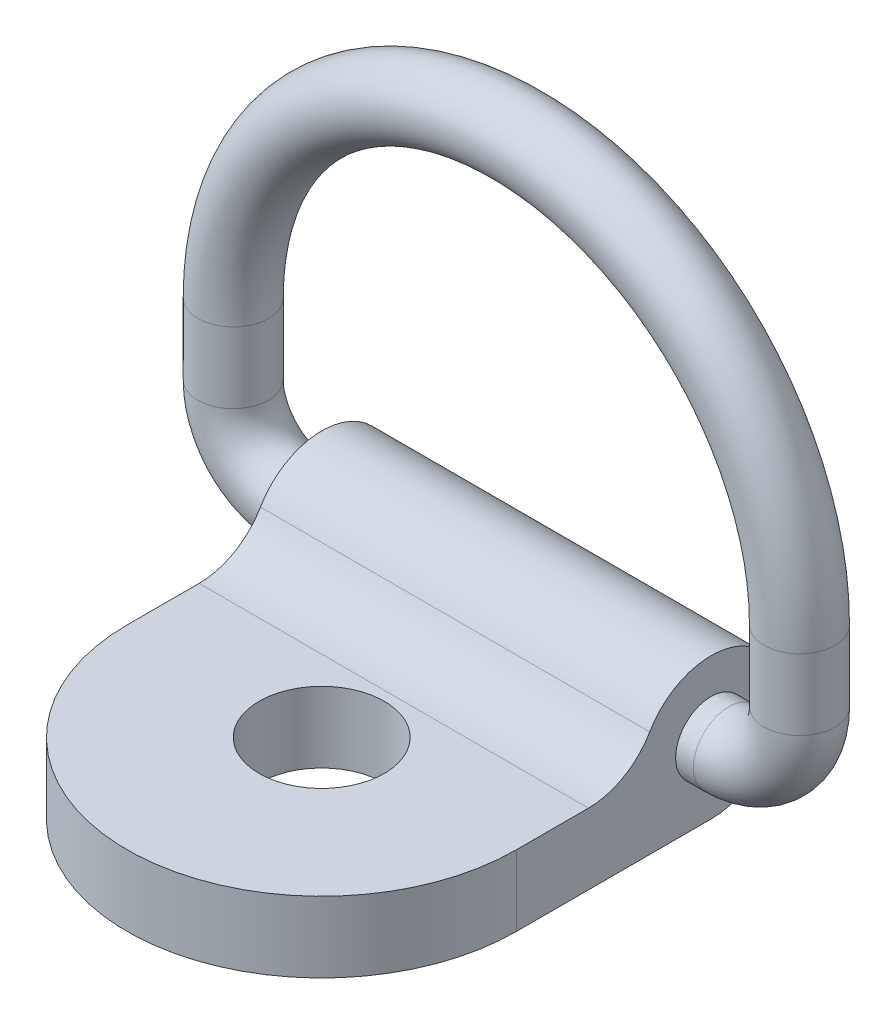
ISO-10303-21;
HEADER;
FILE_DESCRIPTION(('STEP AP214'),'2;1');
FILE_NAME('part.step','',(''),(''),'','','');
FILE_SCHEMA(('AUTOMOTIVE_DESIGN { 1 0 10303 214 1 1 1 1 }'));
ENDSEC;
DATA;
#1=APPLICATION_CONTEXT('core data for automotive mechanical design processes');
#2=APPLICATION_PROTOCOL_DEFINITION('international standard','automotive_design',2000,#1);
#3=PRODUCT_CONTEXT('',#1,'mechanical');
#4=PRODUCT('Part','Part','',(#3));
#5=PRODUCT_RELATED_PRODUCT_CATEGORY('part','',(#4));
#6=PRODUCT_DEFINITION_FORMATION('','',#4);
#7=PRODUCT_DEFINITION_CONTEXT('part definition',#1,'design');
#8=PRODUCT_DEFINITION('design','',#6,#7);
#9=PRODUCT_DEFINITION_SHAPE('','',#8);
#10=(LENGTH_UNIT() NAMED_UNIT(*) SI_UNIT(.MILLI.,.METRE.));
#11=(NAMED_UNIT(*) PLANE_ANGLE_UNIT() SI_UNIT($,.RADIAN.));
#12=(NAMED_UNIT(*) SI_UNIT($,.STERADIAN.) SOLID_ANGLE_UNIT());
#13=UNCERTAINTY_MEASURE_WITH_UNIT(LENGTH_MEASURE(1.E-05),#10,'distance_accuracy_value','');
#14=(GEOMETRIC_REPRESENTATION_CONTEXT(3) GLOBAL_UNCERTAINTY_ASSIGNED_CONTEXT((#13)) GLOBAL_UNIT_ASSIGNED_CONTEXT((#10,
#11,#12)) REPRESENTATION_CONTEXT('',''));
#15=CARTESIAN_POINT('',(0.,0.,0.));
#16=DIRECTION('',(0.,0.,1.));
#17=DIRECTION('',(1.,0.,0.));
#18=AXIS2_PLACEMENT_3D('',#15,#16,#17);
#19=CARTESIAN_POINT('',(0.,-3.175,8.73125));
#20=DIRECTION('',(0.,-1.,0.));
#21=DIRECTION('',(0.,0.,-1.));
#22=AXIS2_PLACEMENT_3D('',#19,#20,#21);
#23=CYLINDRICAL_SURFACE('',#22,8.73125);
#24=DIRECTION('',(0.,1.,0.));
#25=VECTOR('',#24,1.);
#26=CARTESIAN_POINT('',(-8.73125,-3.175,8.73125));
#27=LINE('',#26,#25);
#28=CARTESIAN_POINT('',(-8.73125,-3.175,8.73125));
#29=VERTEX_POINT('',#28);
#30=CARTESIAN_POINT('',(-8.73125,0.,8.73125));
#31=VERTEX_POINT('',#30);
#32=EDGE_CURVE('E164',#29,#31,#27,.T.);
#33=ORIENTED_EDGE('',*,*,#32,.F.);
#34=CARTESIAN_POINT('',(0.,-3.175,8.73125));
#35=DIRECTION('',(0.,1.,0.));
#36=DIRECTION('',(0.,0.,1.));
#37=AXIS2_PLACEMENT_3D('',#34,#35,#36);
#38=CIRCLE('',#37,8.73125);
#39=CARTESIAN_POINT('',(8.73125,-3.175,8.73125));
#40=VERTEX_POINT('',#39);
#41=EDGE_CURVE('E47',#40,#29,#38,.F.);
#42=ORIENTED_EDGE('',*,*,#41,.F.);
#43=DIRECTION('',(0.,-1.,0.));
#44=VECTOR('',#43,1.);
#45=CARTESIAN_POINT('',(8.73125,3.175,8.73125000000001));
#46=LINE('',#45,#44);
#47=CARTESIAN_POINT('',(8.73125,0.,8.73125));
#48=VERTEX_POINT('',#47);
#49=EDGE_CURVE('E91',#48,#40,#46,.T.);
#50=ORIENTED_EDGE('',*,*,#49,.F.);
#51=CARTESIAN_POINT('',(0.,0.,8.73125));
#52=DIRECTION('',(0.,-1.,0.));
#53=DIRECTION('',(0.,0.,-1.));
#54=AXIS2_PLACEMENT_3D('',#51,#52,#53);
#55=CIRCLE('',#54,8.73125);
#56=EDGE_CURVE('E11',#31,#48,#55,.F.);
#57=ORIENTED_EDGE('',*,*,#56,.F.);
#58=EDGE_LOOP('',(#33,#42,#50,#57));
#59=FACE_BOUND('',#58,.T.);
#60=ADVANCED_FACE('F39',(#59),#23,.T.);
#61=CARTESIAN_POINT('',(9.525,0.,0.));
#62=DIRECTION('',(-1.,0.,0.));
#63=DIRECTION('',(0.,0.,1.));
#64=AXIS2_PLACEMENT_3D('',#61,#62,#63);
#65=CYLINDRICAL_SURFACE('',#64,1.5875);
#66=CARTESIAN_POINT('',(9.525,0.,0.));
#67=DIRECTION('',(1.,0.,0.));
#68=DIRECTION('',(0.,0.,-1.));
#69=AXIS2_PLACEMENT_3D('',#66,#67,#68);
#70=CIRCLE('',#69,1.5875);
#71=CARTESIAN_POINT('',(9.525,-1.5875,0.));
#72=VERTEX_POINT('',#71);
#73=EDGE_CURVE('E104',#72,#72,#70,.T.);
#74=ORIENTED_EDGE('',*,*,#73,.F.);
#75=EDGE_LOOP('',(#74));
#76=FACE_BOUND('',#75,.T.);
#77=CARTESIAN_POINT('',(8.73125,0.,0.));
#78=DIRECTION('',(-1.,0.,0.));
#79=DIRECTION('',(0.,0.,1.));
#80=AXIS2_PLACEMENT_3D('',#77,#78,#79);
#81=CIRCLE('',#80,1.5875);
#82=CARTESIAN_POINT('',(8.73125,0.,1.5875));
#83=VERTEX_POINT('',#82);
#84=EDGE_CURVE('E160',#83,#83,#81,.T.);
#85=ORIENTED_EDGE('',*,*,#84,.F.);
#86=EDGE_LOOP('',(#85));
#87=FACE_BOUND('',#86,.T.);
#88=ADVANCED_FACE('F193',(#76,#87),#65,.T.);
#89=CARTESIAN_POINT('',(-9.525,3.175,0.));
#90=DIRECTION('',(0.,0.,1.));
#91=DIRECTION('',(1.,0.,0.));
#92=AXIS2_PLACEMENT_3D('',#89,#90,#91);
#93=TOROIDAL_SURFACE('',#92,3.175,1.5875);
#94=CARTESIAN_POINT('',(-12.7,3.17499999999982,0.));
#95=DIRECTION('',(0.,-1.,0.));
#96=DIRECTION('',(0.,0.,-1.));
#97=AXIS2_PLACEMENT_3D('',#94,#95,#96);
#98=CIRCLE('',#97,1.5875);
#99=CARTESIAN_POINT('',(-14.2875,3.17499999999974,0.));
#100=VERTEX_POINT('',#99);
#101=EDGE_CURVE('E152',#100,#100,#98,.T.);
#102=CARTESIAN_POINT('',(-9.52499999999982,0.,0.));
#103=DIRECTION('',(1.,0.,0.));
#104=DIRECTION('',(0.,0.,-1.));
#105=AXIS2_PLACEMENT_3D('',#102,#103,#104);
#106=CIRCLE('',#105,1.5875);
#107=CARTESIAN_POINT('',(-9.52499999999973,-1.5875,0.));
#108=VERTEX_POINT('',#107);
#109=EDGE_CURVE('E156',#108,#108,#106,.T.);
#110=CARTESIAN_POINT('',(-9.525,3.175,0.));
#111=DIRECTION('',(0.,0.,1.));
#112=DIRECTION('',(1.,0.,0.));
#113=AXIS2_PLACEMENT_3D('',#110,#111,#112);
#114=CIRCLE('',#113,4.7625);
#115=EDGE_CURVE('',#100,#108,#114,.T.);
#116=ORIENTED_EDGE('',*,*,#101,.T.);
#117=ORIENTED_EDGE('',*,*,#109,.F.);
#118=ORIENTED_EDGE('',*,*,#115,.T.);
#119=ORIENTED_EDGE('',*,*,#115,.F.);
#120=EDGE_LOOP('',(#116,#118,#117,#119));
#121=FACE_BOUND('',#120,.T.);
#122=ADVANCED_FACE('F197',(#121),#93,.T.);
#123=CARTESIAN_POINT('',(-12.7,6.34999999999983,0.));
#124=DIRECTION('',(0.,-1.,0.));
#125=DIRECTION('',(0.,0.,-1.));
#126=AXIS2_PLACEMENT_3D('',#123,#124,#125);
#127=CYLINDRICAL_SURFACE('',#126,1.5875);
#128=CARTESIAN_POINT('',(-12.7,6.34999999999983,0.));
#129=DIRECTION('',(0.,-1.,0.));
#130=DIRECTION('',(0.,0.,-1.));
#131=AXIS2_PLACEMENT_3D('',#128,#129,#130);
#132=CIRCLE('',#131,1.5875);
#133=CARTESIAN_POINT('',(-14.2875,6.3499999999998,0.));
#134=VERTEX_POINT('',#133);
#135=EDGE_CURVE('E148',#134,#134,#132,.T.);
#136=ORIENTED_EDGE('',*,*,#135,.T.);
#137=EDGE_LOOP('',(#136));
#138=FACE_BOUND('',#137,.T.);
#139=ORIENTED_EDGE('',*,*,#101,.F.);
#140=EDGE_LOOP('',(#139));
#141=FACE_BOUND('',#140,.T.);
#142=ADVANCED_FACE('F204',(#138,#141),#127,.T.);
#143=CARTESIAN_POINT('',(0.,6.35,0.));
#144=DIRECTION('',(0.,0.,1.));
#145=DIRECTION('',(1.,0.,0.));
#146=AXIS2_PLACEMENT_3D('',#143,#144,#145);
#147=TOROIDAL_SURFACE('',#146,12.7,1.5875);
#148=CARTESIAN_POINT('',(12.7,6.35,0.));
#149=DIRECTION('',(0.,1.,0.));
#150=DIRECTION('',(0.,0.,-1.));
#151=AXIS2_PLACEMENT_3D('',#148,#149,#150);
#152=CIRCLE('',#151,1.5875);
#153=CARTESIAN_POINT('',(14.2875,6.35,0.));
#154=VERTEX_POINT('',#153);
#155=EDGE_CURVE('E144',#154,#154,#152,.T.);
#156=CARTESIAN_POINT('',(0.,6.35,0.));
#157=DIRECTION('',(0.,0.,1.));
#158=DIRECTION('',(1.,0.,0.));
#159=AXIS2_PLACEMENT_3D('',#156,#157,#158);
#160=CIRCLE('',#159,14.2875);
#161=EDGE_CURVE('',#154,#134,#160,.T.);
#162=ORIENTED_EDGE('',*,*,#155,.T.);
#163=ORIENTED_EDGE('',*,*,#135,.F.);
#164=ORIENTED_EDGE('',*,*,#161,.T.);
#165=ORIENTED_EDGE('',*,*,#161,.F.);
#166=EDGE_LOOP('',(#162,#164,#163,#165));
#167=FACE_BOUND('',#166,.T.);
#168=ADVANCED_FACE('F293',(#167),#147,.T.);
#169=CARTESIAN_POINT('',(12.7,3.175,0.));
#170=DIRECTION('',(0.,1.,0.));
#171=DIRECTION('',(0.,0.,1.));
#172=AXIS2_PLACEMENT_3D('',#169,#170,#171);
#173=CYLINDRICAL_SURFACE('',#172,1.5875);
#174=CARTESIAN_POINT('',(12.7,3.175,0.));
#175=DIRECTION('',(0.,1.,0.));
#176=DIRECTION('',(0.,0.,-1.));
#177=AXIS2_PLACEMENT_3D('',#174,#175,#176);
#178=CIRCLE('',#177,1.5875);
#179=CARTESIAN_POINT('',(14.2875,3.175,0.));
#180=VERTEX_POINT('',#179);
#181=EDGE_CURVE('E140',#180,#180,#178,.T.);
#182=ORIENTED_EDGE('',*,*,#181,.T.);
#183=EDGE_LOOP('',(#182));
#184=FACE_BOUND('',#183,.T.);
#185=ORIENTED_EDGE('',*,*,#155,.F.);
#186=EDGE_LOOP('',(#185));
#187=FACE_BOUND('',#186,.T.);
#188=ADVANCED_FACE('F218',(#184,#187),#173,.T.);
#189=CARTESIAN_POINT('',(9.525,3.175,0.));
#190=DIRECTION('',(0.,0.,1.));
#191=DIRECTION('',(1.,0.,0.));
#192=AXIS2_PLACEMENT_3D('',#189,#190,#191);
#193=TOROIDAL_SURFACE('',#192,3.175,1.5875);
#194=CARTESIAN_POINT('',(9.525,3.175,0.));
#195=DIRECTION('',(0.,0.,1.));
#196=DIRECTION('',(1.,0.,0.));
#197=AXIS2_PLACEMENT_3D('',#194,#195,#196);
#198=CIRCLE('',#197,4.7625);
#199=EDGE_CURVE('',#72,#180,#198,.T.);
#200=ORIENTED_EDGE('',*,*,#73,.T.);
#201=ORIENTED_EDGE('',*,*,#181,.F.);
#202=ORIENTED_EDGE('',*,*,#199,.T.);
#203=ORIENTED_EDGE('',*,*,#199,.F.);
#204=EDGE_LOOP('',(#200,#202,#201,#203));
#205=FACE_BOUND('',#204,.T.);
#206=ADVANCED_FACE('F211',(#205),#193,.T.);
#207=CARTESIAN_POINT('',(-8.73125,0.,0.));
#208=DIRECTION('',(1.,0.,0.));
#209=DIRECTION('',(0.,0.,-1.));
#210=AXIS2_PLACEMENT_3D('',#207,#208,#209);
#211=CIRCLE('',#210,1.5875);
#212=CARTESIAN_POINT('',(-8.73125,0.,-1.5875));
#213=VERTEX_POINT('',#212);
#214=EDGE_CURVE('E124',#213,#213,#211,.T.);
#215=ORIENTED_EDGE('',*,*,#214,.F.);
#216=EDGE_LOOP('',(#215));
#217=FACE_BOUND('',#216,.T.);
#218=ORIENTED_EDGE('',*,*,#109,.T.);
#219=EDGE_LOOP('',(#218));
#220=FACE_BOUND('',#219,.T.);
#221=ADVANCED_FACE('F200',(#217,#220),#65,.T.);
#222=CARTESIAN_POINT('',(8.73125,3.175,5.49926131403118));
#223=DIRECTION('',(-1.,0.,0.));
#224=DIRECTION('',(0.,0.,1.));
#225=AXIS2_PLACEMENT_3D('',#222,#223,#224);
#226=PLANE('',#225);
#227=DIRECTION('',(0.,0.,1.));
#228=VECTOR('',#227,1.);
#229=CARTESIAN_POINT('',(8.73125,0.,17.4625));
#230=LINE('',#229,#228);
#231=CARTESIAN_POINT('',(8.73125,0.,5.49926131403118));
#232=VERTEX_POINT('',#231);
#233=EDGE_CURVE('E114',#232,#48,#230,.T.);
#234=ORIENTED_EDGE('',*,*,#233,.T.);
#235=ORIENTED_EDGE('',*,*,#49,.T.);
#236=DIRECTION('',(0.,0.,-1.));
#237=VECTOR('',#236,1.);
#238=CARTESIAN_POINT('',(8.73125,-3.175,17.4625));
#239=LINE('',#238,#237);
#240=CARTESIAN_POINT('',(8.73125,-3.175,0.));
#241=VERTEX_POINT('',#240);
#242=EDGE_CURVE('E83',#40,#241,#239,.T.);
#243=ORIENTED_EDGE('',*,*,#242,.T.);
#244=CARTESIAN_POINT('',(8.73125,0.,0.));
#245=DIRECTION('',(1.,0.,0.));
#246=DIRECTION('',(0.,0.,-1.));
#247=AXIS2_PLACEMENT_3D('',#244,#245,#246);
#248=CIRCLE('',#247,3.175);
#249=CARTESIAN_POINT('',(8.73125,1.5875,2.74963065701559));
#250=VERTEX_POINT('',#249);
#251=EDGE_CURVE('E89',#241,#250,#248,.T.);
#252=ORIENTED_EDGE('',*,*,#251,.T.);
#253=CARTESIAN_POINT('',(8.73125,3.175,5.49926131403118));
#254=DIRECTION('',(-1.,0.,0.));
#255=DIRECTION('',(0.,0.,1.));
#256=AXIS2_PLACEMENT_3D('',#253,#254,#255);
#257=CIRCLE('',#256,3.175);
#258=EDGE_CURVE('E111',#250,#232,#257,.T.);
#259=ORIENTED_EDGE('',*,*,#258,.T.);
#260=EDGE_LOOP('',(#234,#235,#243,#252,#259));
#261=FACE_BOUND('',#260,.T.);
#262=ORIENTED_EDGE('',*,*,#84,.T.);
#263=EDGE_LOOP('',(#262));
#264=FACE_BOUND('',#263,.T.);
#265=ADVANCED_FACE('F86',(#261,#264),#226,.F.);
#266=CARTESIAN_POINT('',(-8.73125,3.175,5.49926131403118));
#267=DIRECTION('',(-1.,0.,0.));
#268=DIRECTION('',(0.,0.,1.));
#269=AXIS2_PLACEMENT_3D('',#266,#267,#268);
#270=PLANE('',#269);
#271=DIRECTION('',(0.,0.,-1.));
#272=VECTOR('',#271,1.);
#273=CARTESIAN_POINT('',(-8.73125,-3.175,17.4625));
#274=LINE('',#273,#272);
#275=CARTESIAN_POINT('',(-8.73125,-3.175,0.));
#276=VERTEX_POINT('',#275);
#277=EDGE_CURVE('E100',#29,#276,#274,.T.);
#278=ORIENTED_EDGE('',*,*,#277,.F.);
#279=ORIENTED_EDGE('',*,*,#32,.T.);
#280=DIRECTION('',(0.,0.,1.));
#281=VECTOR('',#280,1.);
#282=CARTESIAN_POINT('',(-8.73125,0.,17.4625));
#283=LINE('',#282,#281);
#284=CARTESIAN_POINT('',(-8.73125,0.,5.49926131403118));
#285=VERTEX_POINT('',#284);
#286=EDGE_CURVE('E94',#285,#31,#283,.T.);
#287=ORIENTED_EDGE('',*,*,#286,.F.);
#288=CARTESIAN_POINT('',(-8.73125,3.175,5.49926131403118));
#289=DIRECTION('',(-1.,0.,0.));
#290=DIRECTION('',(0.,0.,1.));
#291=AXIS2_PLACEMENT_3D('',#288,#289,#290);
#292=CIRCLE('',#291,3.175);
#293=CARTESIAN_POINT('',(-8.73125,1.5875,2.74963065701559));
#294=VERTEX_POINT('',#293);
#295=EDGE_CURVE('E127',#294,#285,#292,.T.);
#296=ORIENTED_EDGE('',*,*,#295,.F.);
#297=CARTESIAN_POINT('',(-8.73125,0.,0.));
#298=DIRECTION('',(1.,0.,0.));
#299=DIRECTION('',(0.,0.,-1.));
#300=AXIS2_PLACEMENT_3D('',#297,#298,#299);
#301=CIRCLE('',#300,3.175);
#302=EDGE_CURVE('E123',#276,#294,#301,.T.);
#303=ORIENTED_EDGE('',*,*,#302,.F.);
#304=EDGE_LOOP('',(#278,#279,#287,#296,#303));
#305=FACE_BOUND('',#304,.T.);
#306=ORIENTED_EDGE('',*,*,#214,.T.);
#307=EDGE_LOOP('',(#306));
#308=FACE_BOUND('',#307,.T.);
#309=ADVANCED_FACE('F172',(#305,#308),#270,.T.);
#310=CARTESIAN_POINT('',(8.73125,-3.175,17.4625));
#311=DIRECTION('',(0.,1.,0.));
#312=DIRECTION('',(0.,0.,1.));
#313=AXIS2_PLACEMENT_3D('',#310,#311,#312);
#314=PLANE('',#313);
#315=CARTESIAN_POINT('',(0.,-3.17499999999998,8.73125));
#316=DIRECTION('',(0.,1.,0.));
#317=DIRECTION('',(0.,0.,1.));
#318=AXIS2_PLACEMENT_3D('',#315,#316,#317);
#319=CIRCLE('',#318,2.80669999999995);
#320=CARTESIAN_POINT('',(0.,-3.17499999999998,11.53795));
#321=VERTEX_POINT('',#320);
#322=EDGE_CURVE('E226',#321,#321,#319,.T.);
#323=ORIENTED_EDGE('',*,*,#322,.T.);
#324=EDGE_LOOP('',(#323));
#325=FACE_BOUND('',#324,.T.);
#326=ORIENTED_EDGE('',*,*,#242,.F.);
#327=ORIENTED_EDGE('',*,*,#41,.T.);
#328=ORIENTED_EDGE('',*,*,#277,.T.);
#329=DIRECTION('',(-1.,0.,0.));
#330=VECTOR('',#329,1.);
#331=CARTESIAN_POINT('',(8.73125,-3.175,0.));
#332=LINE('',#331,#330);
#333=EDGE_CURVE('E97',#241,#276,#332,.T.);
#334=ORIENTED_EDGE('',*,*,#333,.F.);
#335=EDGE_LOOP('',(#326,#327,#328,#334));
#336=FACE_BOUND('',#335,.T.);
#337=ADVANCED_FACE('F98',(#325,#336),#314,.F.);
#338=CARTESIAN_POINT('',(8.73125,0.,0.));
#339=DIRECTION('',(-1.,0.,0.));
#340=DIRECTION('',(0.,0.,1.));
#341=AXIS2_PLACEMENT_3D('',#338,#339,#340);
#342=CYLINDRICAL_SURFACE('',#341,3.175);
#343=ORIENTED_EDGE('',*,*,#302,.T.);
#344=DIRECTION('',(-1.,0.,0.));
#345=VECTOR('',#344,1.);
#346=CARTESIAN_POINT('',(8.73125,1.5875,2.74963065701559));
#347=LINE('',#346,#345);
#348=EDGE_CURVE('E105',#250,#294,#347,.T.);
#349=ORIENTED_EDGE('',*,*,#348,.F.);
#350=ORIENTED_EDGE('',*,*,#251,.F.);
#351=ORIENTED_EDGE('',*,*,#333,.T.);
#352=EDGE_LOOP('',(#343,#349,#350,#351));
#353=FACE_BOUND('',#352,.T.);
#354=ADVANCED_FACE('F107',(#353),#342,.T.);
#355=CARTESIAN_POINT('',(8.73125,3.175,5.49926131403118));
#356=DIRECTION('',(-1.,0.,0.));
#357=DIRECTION('',(0.,0.,1.));
#358=AXIS2_PLACEMENT_3D('',#355,#356,#357);
#359=CYLINDRICAL_SURFACE('',#358,3.175);
#360=ORIENTED_EDGE('',*,*,#295,.T.);
#361=DIRECTION('',(-1.,0.,0.));
#362=VECTOR('',#361,1.);
#363=CARTESIAN_POINT('',(8.73125,0.,5.49926131403118));
#364=LINE('',#363,#362);
#365=EDGE_CURVE('E120',#232,#285,#364,.T.);
#366=ORIENTED_EDGE('',*,*,#365,.F.);
#367=ORIENTED_EDGE('',*,*,#258,.F.);
#368=ORIENTED_EDGE('',*,*,#348,.T.);
#369=EDGE_LOOP('',(#360,#366,#367,#368));
#370=FACE_BOUND('',#369,.T.);
#371=ADVANCED_FACE('F176',(#370),#359,.F.);
#372=CARTESIAN_POINT('',(8.73125,0.,17.4625));
#373=DIRECTION('',(0.,-1.,0.));
#374=DIRECTION('',(0.,0.,-1.));
#375=AXIS2_PLACEMENT_3D('',#372,#373,#374);
#376=PLANE('',#375);
#377=CARTESIAN_POINT('',(0.,0.,8.73125));
#378=DIRECTION('',(0.,1.,0.));
#379=DIRECTION('',(0.,0.,1.));
#380=AXIS2_PLACEMENT_3D('',#377,#378,#379);
#381=CIRCLE('',#380,2.80669999999999);
#382=CARTESIAN_POINT('',(0.,0.,11.53795));
#383=VERTEX_POINT('',#382);
#384=EDGE_CURVE('E229',#383,#383,#381,.T.);
#385=ORIENTED_EDGE('',*,*,#384,.F.);
#386=EDGE_LOOP('',(#385));
#387=FACE_BOUND('',#386,.T.);
#388=ORIENTED_EDGE('',*,*,#286,.T.);
#389=ORIENTED_EDGE('',*,*,#56,.T.);
#390=ORIENTED_EDGE('',*,*,#233,.F.);
#391=ORIENTED_EDGE('',*,*,#365,.T.);
#392=EDGE_LOOP('',(#388,#389,#390,#391));
#393=FACE_BOUND('',#392,.T.);
#394=ADVANCED_FACE('F178',(#387,#393),#376,.F.);
#395=CARTESIAN_POINT('',(0.,0.,8.73125));
#396=DIRECTION('',(0.,1.,0.));
#397=DIRECTION('',(0.,0.,1.));
#398=AXIS2_PLACEMENT_3D('',#395,#396,#397);
#399=CYLINDRICAL_SURFACE('',#398,2.80669999999997);
#400=ORIENTED_EDGE('',*,*,#322,.F.);
#401=EDGE_LOOP('',(#400));
#402=FACE_BOUND('',#401,.T.);
#403=ORIENTED_EDGE('',*,*,#384,.T.);
#404=EDGE_LOOP('',(#403));
#405=FACE_BOUND('',#404,.T.);
#406=ADVANCED_FACE('F180',(#402,#405),#399,.F.);
#407=CLOSED_SHELL('',(#60,#88,#122,#142,#168,#188,#206,#221,#265,#309,#337,#354,#371,#394,#406));
#408=MANIFOLD_SOLID_BREP('B2',#407);
#409=ADVANCED_BREP_SHAPE_REPRESENTATION('',(#18,#408),#14);
#410=SHAPE_DEFINITION_REPRESENTATION(#9,#409);
ENDSEC;
END-ISO-10303-21;
